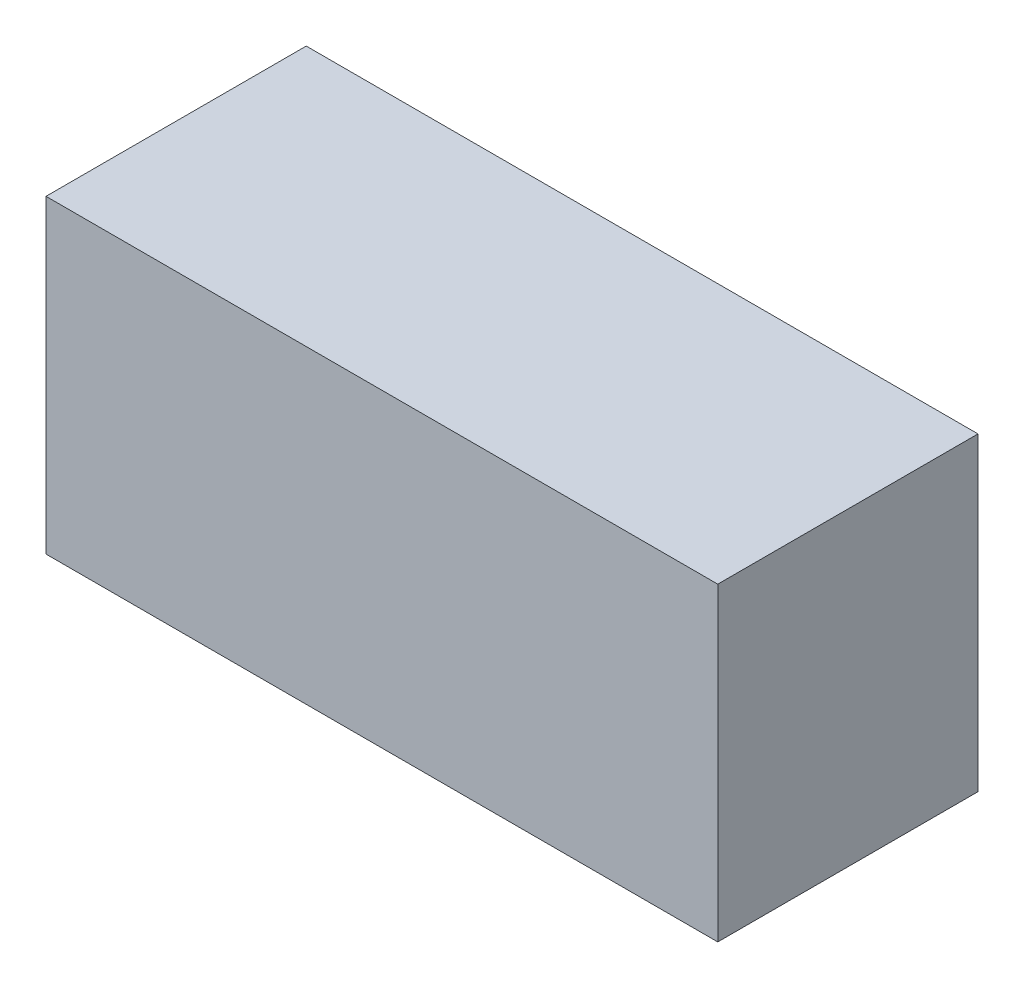
ISO-10303-21;
HEADER;
FILE_DESCRIPTION(('STEP AP214'),'2;1');
FILE_NAME('part.step','',(''),(''),'','','');
FILE_SCHEMA(('AUTOMOTIVE_DESIGN { 1 0 10303 214 1 1 1 1 }'));
ENDSEC;
DATA;
#1=APPLICATION_CONTEXT('core data for automotive mechanical design processes');
#2=APPLICATION_PROTOCOL_DEFINITION('international standard','automotive_design',2000,#1);
#3=PRODUCT_CONTEXT('',#1,'mechanical');
#4=PRODUCT('Part','Part','',(#3));
#5=PRODUCT_RELATED_PRODUCT_CATEGORY('part','',(#4));
#6=PRODUCT_DEFINITION_FORMATION('','',#4);
#7=PRODUCT_DEFINITION_CONTEXT('part definition',#1,'design');
#8=PRODUCT_DEFINITION('design','',#6,#7);
#9=PRODUCT_DEFINITION_SHAPE('','',#8);
#10=(LENGTH_UNIT() NAMED_UNIT(*) SI_UNIT(.MILLI.,.METRE.));
#11=(NAMED_UNIT(*) PLANE_ANGLE_UNIT() SI_UNIT($,.RADIAN.));
#12=(NAMED_UNIT(*) SI_UNIT($,.STERADIAN.) SOLID_ANGLE_UNIT());
#13=UNCERTAINTY_MEASURE_WITH_UNIT(LENGTH_MEASURE(1.E-05),#10,'distance_accuracy_value','');
#14=(GEOMETRIC_REPRESENTATION_CONTEXT(3) GLOBAL_UNCERTAINTY_ASSIGNED_CONTEXT((#13)) GLOBAL_UNIT_ASSIGNED_CONTEXT((#10,
#11,#12)) REPRESENTATION_CONTEXT('',''));
#15=CARTESIAN_POINT('',(0.,0.,0.));
#16=DIRECTION('',(0.,0.,1.));
#17=DIRECTION('',(1.,0.,0.));
#18=AXIS2_PLACEMENT_3D('',#15,#16,#17);
#19=CARTESIAN_POINT('',(0.,0.,21.5));
#20=DIRECTION('',(0.,0.,-1.));
#21=DIRECTION('',(-1.,0.,0.));
#22=AXIS2_PLACEMENT_3D('',#19,#20,#21);
#23=PLANE('',#22);
#24=DIRECTION('',(0.,-1.,0.));
#25=VECTOR('',#24,1.);
#26=CARTESIAN_POINT('',(-27.75,12.8,21.5));
#27=LINE('',#26,#25);
#28=CARTESIAN_POINT('',(-27.75,12.8,21.5));
#29=VERTEX_POINT('',#28);
#30=CARTESIAN_POINT('',(-27.75,-12.8,21.5));
#31=VERTEX_POINT('',#30);
#32=EDGE_CURVE('E140',#29,#31,#27,.T.);
#33=ORIENTED_EDGE('',*,*,#32,.T.);
#34=DIRECTION('',(1.,0.,0.));
#35=VECTOR('',#34,1.);
#36=CARTESIAN_POINT('',(27.75,-12.8,21.5));
#37=LINE('',#36,#35);
#38=CARTESIAN_POINT('',(27.75,-12.8,21.5));
#39=VERTEX_POINT('',#38);
#40=EDGE_CURVE('E143',#31,#39,#37,.T.);
#41=ORIENTED_EDGE('',*,*,#40,.T.);
#42=DIRECTION('',(0.,1.,0.));
#43=VECTOR('',#42,1.);
#44=CARTESIAN_POINT('',(27.75,12.8,21.5));
#45=LINE('',#44,#43);
#46=CARTESIAN_POINT('',(27.75,12.8,21.5));
#47=VERTEX_POINT('',#46);
#48=EDGE_CURVE('E146',#39,#47,#45,.T.);
#49=ORIENTED_EDGE('',*,*,#48,.T.);
#50=DIRECTION('',(-1.,0.,0.));
#51=VECTOR('',#50,1.);
#52=CARTESIAN_POINT('',(27.75,12.8,21.5));
#53=LINE('',#52,#51);
#54=EDGE_CURVE('E148',#47,#29,#53,.T.);
#55=ORIENTED_EDGE('',*,*,#54,.T.);
#56=EDGE_LOOP('',(#33,#41,#49,#55));
#57=FACE_BOUND('',#56,.T.);
#58=ADVANCED_FACE('F35',(#57),#23,.F.);
#59=CARTESIAN_POINT('',(0.,0.,0.));
#60=DIRECTION('',(0.,0.,-1.));
#61=DIRECTION('',(-1.,0.,0.));
#62=AXIS2_PLACEMENT_3D('',#59,#60,#61);
#63=PLANE('',#62);
#64=DIRECTION('',(-1.,0.,0.));
#65=VECTOR('',#64,1.);
#66=CARTESIAN_POINT('',(-19.75,10.,0.));
#67=LINE('',#66,#65);
#68=CARTESIAN_POINT('',(-19.75,10.,0.));
#69=VERTEX_POINT('',#68);
#70=CARTESIAN_POINT('',(-24.75,10.,0.));
#71=VERTEX_POINT('',#70);
#72=EDGE_CURVE('E106',#69,#71,#67,.T.);
#73=ORIENTED_EDGE('',*,*,#72,.T.);
#74=DIRECTION('',(0.,-1.,0.));
#75=VECTOR('',#74,1.);
#76=CARTESIAN_POINT('',(-24.75,10.,0.));
#77=LINE('',#76,#75);
#78=CARTESIAN_POINT('',(-24.75,-10.,0.));
#79=VERTEX_POINT('',#78);
#80=EDGE_CURVE('E126',#71,#79,#77,.T.);
#81=ORIENTED_EDGE('',*,*,#80,.T.);
#82=DIRECTION('',(1.,0.,0.));
#83=VECTOR('',#82,1.);
#84=CARTESIAN_POINT('',(-19.75,-10.,0.));
#85=LINE('',#84,#83);
#86=CARTESIAN_POINT('',(-19.75,-10.,0.));
#87=VERTEX_POINT('',#86);
#88=EDGE_CURVE('E129',#79,#87,#85,.T.);
#89=ORIENTED_EDGE('',*,*,#88,.T.);
#90=DIRECTION('',(0.,1.,0.));
#91=VECTOR('',#90,1.);
#92=CARTESIAN_POINT('',(-19.75,10.,0.));
#93=LINE('',#92,#91);
#94=EDGE_CURVE('E132',#87,#69,#93,.T.);
#95=ORIENTED_EDGE('',*,*,#94,.T.);
#96=EDGE_LOOP('',(#73,#81,#89,#95));
#97=FACE_BOUND('',#96,.T.);
#98=DIRECTION('',(0.,-1.,0.));
#99=VECTOR('',#98,1.);
#100=CARTESIAN_POINT('',(-27.75,12.8,0.));
#101=LINE('',#100,#99);
#102=CARTESIAN_POINT('',(-27.75,12.8,0.));
#103=VERTEX_POINT('',#102);
#104=CARTESIAN_POINT('',(-27.75,-12.8,0.));
#105=VERTEX_POINT('',#104);
#106=EDGE_CURVE('E139',#103,#105,#101,.T.);
#107=ORIENTED_EDGE('',*,*,#106,.F.);
#108=DIRECTION('',(-1.,0.,0.));
#109=VECTOR('',#108,1.);
#110=CARTESIAN_POINT('',(27.75,12.8,0.));
#111=LINE('',#110,#109);
#112=CARTESIAN_POINT('',(27.75,12.8,0.));
#113=VERTEX_POINT('',#112);
#114=EDGE_CURVE('E144',#113,#103,#111,.T.);
#115=ORIENTED_EDGE('',*,*,#114,.F.);
#116=DIRECTION('',(0.,1.,0.));
#117=VECTOR('',#116,1.);
#118=CARTESIAN_POINT('',(27.75,12.8,0.));
#119=LINE('',#118,#117);
#120=CARTESIAN_POINT('',(27.75,-12.8,0.));
#121=VERTEX_POINT('',#120);
#122=EDGE_CURVE('E155',#121,#113,#119,.T.);
#123=ORIENTED_EDGE('',*,*,#122,.F.);
#124=DIRECTION('',(1.,0.,0.));
#125=VECTOR('',#124,1.);
#126=CARTESIAN_POINT('',(27.75,-12.8,0.));
#127=LINE('',#126,#125);
#128=EDGE_CURVE('E153',#105,#121,#127,.T.);
#129=ORIENTED_EDGE('',*,*,#128,.F.);
#130=EDGE_LOOP('',(#107,#115,#123,#129));
#131=FACE_BOUND('',#130,.T.);
#132=CARTESIAN_POINT('',(15.75,0.,0.));
#133=DIRECTION('',(0.,0.,1.));
#134=DIRECTION('',(1.,0.,0.));
#135=AXIS2_PLACEMENT_3D('',#132,#133,#134);
#136=CIRCLE('',#135,10.);
#137=CARTESIAN_POINT('',(25.75,0.,0.));
#138=VERTEX_POINT('',#137);
#139=EDGE_CURVE('E122',#138,#138,#136,.T.);
#140=ORIENTED_EDGE('',*,*,#139,.T.);
#141=EDGE_LOOP('',(#140));
#142=FACE_BOUND('',#141,.T.);
#143=ADVANCED_FACE('F176',(#97,#131,#142),#63,.T.);
#144=CARTESIAN_POINT('',(-27.75,12.8,21.5));
#145=DIRECTION('',(1.,0.,0.));
#146=DIRECTION('',(0.,0.,-1.));
#147=AXIS2_PLACEMENT_3D('',#144,#145,#146);
#148=PLANE('',#147);
#149=ORIENTED_EDGE('',*,*,#106,.T.);
#150=DIRECTION('',(0.,0.,-1.));
#151=VECTOR('',#150,1.);
#152=CARTESIAN_POINT('',(-27.75,-12.8,21.5));
#153=LINE('',#152,#151);
#154=EDGE_CURVE('E43',#31,#105,#153,.T.);
#155=ORIENTED_EDGE('',*,*,#154,.F.);
#156=ORIENTED_EDGE('',*,*,#32,.F.);
#157=DIRECTION('',(0.,0.,-1.));
#158=VECTOR('',#157,1.);
#159=CARTESIAN_POINT('',(-27.75,12.8,21.5));
#160=LINE('',#159,#158);
#161=EDGE_CURVE('E150',#29,#103,#160,.T.);
#162=ORIENTED_EDGE('',*,*,#161,.T.);
#163=EDGE_LOOP('',(#149,#155,#156,#162));
#164=FACE_BOUND('',#163,.T.);
#165=ADVANCED_FACE('F37',(#164),#148,.F.);
#166=CARTESIAN_POINT('',(27.75,-12.8,21.5));
#167=DIRECTION('',(0.,1.,0.));
#168=DIRECTION('',(0.,0.,1.));
#169=AXIS2_PLACEMENT_3D('',#166,#167,#168);
#170=PLANE('',#169);
#171=ORIENTED_EDGE('',*,*,#128,.T.);
#172=DIRECTION('',(0.,0.,-1.));
#173=VECTOR('',#172,1.);
#174=CARTESIAN_POINT('',(27.75,-12.8,21.5));
#175=LINE('',#174,#173);
#176=EDGE_CURVE('E163',#39,#121,#175,.T.);
#177=ORIENTED_EDGE('',*,*,#176,.F.);
#178=ORIENTED_EDGE('',*,*,#40,.F.);
#179=ORIENTED_EDGE('',*,*,#154,.T.);
#180=EDGE_LOOP('',(#171,#177,#178,#179));
#181=FACE_BOUND('',#180,.T.);
#182=ADVANCED_FACE('F168',(#181),#170,.F.);
#183=CARTESIAN_POINT('',(27.75,12.8,21.5));
#184=DIRECTION('',(-1.,0.,0.));
#185=DIRECTION('',(0.,0.,1.));
#186=AXIS2_PLACEMENT_3D('',#183,#184,#185);
#187=PLANE('',#186);
#188=ORIENTED_EDGE('',*,*,#122,.T.);
#189=DIRECTION('',(0.,0.,-1.));
#190=VECTOR('',#189,1.);
#191=CARTESIAN_POINT('',(27.75,12.8,21.5));
#192=LINE('',#191,#190);
#193=EDGE_CURVE('E160',#47,#113,#192,.T.);
#194=ORIENTED_EDGE('',*,*,#193,.F.);
#195=ORIENTED_EDGE('',*,*,#48,.F.);
#196=ORIENTED_EDGE('',*,*,#176,.T.);
#197=EDGE_LOOP('',(#188,#194,#195,#196));
#198=FACE_BOUND('',#197,.T.);
#199=ADVANCED_FACE('F181',(#198),#187,.F.);
#200=CARTESIAN_POINT('',(27.75,12.8,21.5));
#201=DIRECTION('',(0.,-1.,0.));
#202=DIRECTION('',(0.,0.,-1.));
#203=AXIS2_PLACEMENT_3D('',#200,#201,#202);
#204=PLANE('',#203);
#205=ORIENTED_EDGE('',*,*,#114,.T.);
#206=ORIENTED_EDGE('',*,*,#161,.F.);
#207=ORIENTED_EDGE('',*,*,#54,.F.);
#208=ORIENTED_EDGE('',*,*,#193,.T.);
#209=EDGE_LOOP('',(#205,#206,#207,#208));
#210=FACE_BOUND('',#209,.T.);
#211=ADVANCED_FACE('F185',(#210),#204,.F.);
#212=CARTESIAN_POINT('',(-24.75,10.,21.5));
#213=DIRECTION('',(1.,0.,0.));
#214=DIRECTION('',(0.,0.,-1.));
#215=AXIS2_PLACEMENT_3D('',#212,#213,#214);
#216=PLANE('',#215);
#217=DIRECTION('',(0.,-1.,0.));
#218=VECTOR('',#217,1.);
#219=CARTESIAN_POINT('',(-24.75,0.,3.));
#220=LINE('',#219,#218);
#221=CARTESIAN_POINT('',(-24.75,10.,3.));
#222=VERTEX_POINT('',#221);
#223=CARTESIAN_POINT('',(-24.75,-10.,3.));
#224=VERTEX_POINT('',#223);
#225=EDGE_CURVE('E50',#222,#224,#220,.T.);
#226=ORIENTED_EDGE('',*,*,#225,.T.);
#227=DIRECTION('',(0.,0.,-1.));
#228=VECTOR('',#227,1.);
#229=CARTESIAN_POINT('',(-24.75,-10.,21.5));
#230=LINE('',#229,#228);
#231=EDGE_CURVE('E137',#224,#79,#230,.T.);
#232=ORIENTED_EDGE('',*,*,#231,.T.);
#233=ORIENTED_EDGE('',*,*,#80,.F.);
#234=DIRECTION('',(0.,0.,-1.));
#235=VECTOR('',#234,1.);
#236=CARTESIAN_POINT('',(-24.75,10.,21.5));
#237=LINE('',#236,#235);
#238=EDGE_CURVE('E111',#222,#71,#237,.T.);
#239=ORIENTED_EDGE('',*,*,#238,.F.);
#240=EDGE_LOOP('',(#226,#232,#233,#239));
#241=FACE_BOUND('',#240,.T.);
#242=ADVANCED_FACE('F195',(#241),#216,.T.);
#243=CARTESIAN_POINT('',(-19.75,-10.,21.5));
#244=DIRECTION('',(0.,1.,0.));
#245=DIRECTION('',(0.,0.,1.));
#246=AXIS2_PLACEMENT_3D('',#243,#244,#245);
#247=PLANE('',#246);
#248=DIRECTION('',(-1.,0.,0.));
#249=VECTOR('',#248,1.);
#250=CARTESIAN_POINT('',(0.,-10.,3.));
#251=LINE('',#250,#249);
#252=CARTESIAN_POINT('',(-19.75,-10.,3.));
#253=VERTEX_POINT('',#252);
#254=EDGE_CURVE('E57',#253,#224,#251,.T.);
#255=ORIENTED_EDGE('',*,*,#254,.F.);
#256=DIRECTION('',(0.,0.,-1.));
#257=VECTOR('',#256,1.);
#258=CARTESIAN_POINT('',(-19.75,-10.,21.5));
#259=LINE('',#258,#257);
#260=EDGE_CURVE('E110',#253,#87,#259,.T.);
#261=ORIENTED_EDGE('',*,*,#260,.T.);
#262=ORIENTED_EDGE('',*,*,#88,.F.);
#263=ORIENTED_EDGE('',*,*,#231,.F.);
#264=EDGE_LOOP('',(#255,#261,#262,#263));
#265=FACE_BOUND('',#264,.T.);
#266=ADVANCED_FACE('F241',(#265),#247,.T.);
#267=CARTESIAN_POINT('',(-19.75,10.,21.5));
#268=DIRECTION('',(-1.,0.,0.));
#269=DIRECTION('',(0.,-1.,0.));
#270=AXIS2_PLACEMENT_3D('',#267,#268,#269);
#271=PLANE('',#270);
#272=DIRECTION('',(0.,-1.,0.));
#273=VECTOR('',#272,1.);
#274=CARTESIAN_POINT('',(-19.75,0.,3.));
#275=LINE('',#274,#273);
#276=CARTESIAN_POINT('',(-19.75,10.,3.));
#277=VERTEX_POINT('',#276);
#278=EDGE_CURVE('E114',#277,#253,#275,.T.);
#279=ORIENTED_EDGE('',*,*,#278,.F.);
#280=DIRECTION('',(0.,0.,-1.));
#281=VECTOR('',#280,1.);
#282=CARTESIAN_POINT('',(-19.75,10.,21.5));
#283=LINE('',#282,#281);
#284=EDGE_CURVE('E100',#277,#69,#283,.T.);
#285=ORIENTED_EDGE('',*,*,#284,.T.);
#286=ORIENTED_EDGE('',*,*,#94,.F.);
#287=ORIENTED_EDGE('',*,*,#260,.F.);
#288=EDGE_LOOP('',(#279,#285,#286,#287));
#289=FACE_BOUND('',#288,.T.);
#290=ADVANCED_FACE('F115',(#289),#271,.T.);
#291=CARTESIAN_POINT('',(-19.75,10.,21.5));
#292=DIRECTION('',(0.,-1.,0.));
#293=DIRECTION('',(0.,0.,-1.));
#294=AXIS2_PLACEMENT_3D('',#291,#292,#293);
#295=PLANE('',#294);
#296=DIRECTION('',(-1.,0.,0.));
#297=VECTOR('',#296,1.);
#298=CARTESIAN_POINT('',(0.,10.,3.));
#299=LINE('',#298,#297);
#300=EDGE_CURVE('E104',#277,#222,#299,.T.);
#301=ORIENTED_EDGE('',*,*,#300,.T.);
#302=ORIENTED_EDGE('',*,*,#238,.T.);
#303=ORIENTED_EDGE('',*,*,#72,.F.);
#304=ORIENTED_EDGE('',*,*,#284,.F.);
#305=EDGE_LOOP('',(#301,#302,#303,#304));
#306=FACE_BOUND('',#305,.T.);
#307=ADVANCED_FACE('F102',(#306),#295,.T.);
#308=CARTESIAN_POINT('',(15.75,0.,21.5));
#309=DIRECTION('',(0.,0.,-1.));
#310=DIRECTION('',(-1.,0.,0.));
#311=AXIS2_PLACEMENT_3D('',#308,#309,#310);
#312=CYLINDRICAL_SURFACE('',#311,10.);
#313=CARTESIAN_POINT('',(15.75,0.,3.));
#314=DIRECTION('',(0.,0.,-1.));
#315=DIRECTION('',(-1.,0.,0.));
#316=AXIS2_PLACEMENT_3D('',#313,#314,#315);
#317=CIRCLE('',#316,10.);
#318=CARTESIAN_POINT('',(5.75000000000001,0.,3.));
#319=VERTEX_POINT('',#318);
#320=EDGE_CURVE('E12',#319,#319,#317,.T.);
#321=ORIENTED_EDGE('',*,*,#320,.F.);
#322=EDGE_LOOP('',(#321));
#323=FACE_BOUND('',#322,.T.);
#324=ORIENTED_EDGE('',*,*,#139,.F.);
#325=EDGE_LOOP('',(#324));
#326=FACE_BOUND('',#325,.T.);
#327=ADVANCED_FACE('F261',(#323,#326),#312,.F.);
#328=CARTESIAN_POINT('',(0.,0.,3.));
#329=DIRECTION('',(0.,0.,-1.));
#330=DIRECTION('',(-1.,0.,0.));
#331=AXIS2_PLACEMENT_3D('',#328,#329,#330);
#332=PLANE('',#331);
#333=ORIENTED_EDGE('',*,*,#278,.T.);
#334=ORIENTED_EDGE('',*,*,#254,.T.);
#335=ORIENTED_EDGE('',*,*,#225,.F.);
#336=ORIENTED_EDGE('',*,*,#300,.F.);
#337=EDGE_LOOP('',(#333,#334,#335,#336));
#338=FACE_BOUND('',#337,.T.);
#339=ADVANCED_FACE('F118',(#338),#332,.T.);
#340=CARTESIAN_POINT('',(0.,0.,3.));
#341=DIRECTION('',(0.,0.,-1.));
#342=DIRECTION('',(-1.,0.,0.));
#343=AXIS2_PLACEMENT_3D('',#340,#341,#342);
#344=PLANE('',#343);
#345=ORIENTED_EDGE('',*,*,#320,.T.);
#346=EDGE_LOOP('',(#345));
#347=FACE_BOUND('',#346,.T.);
#348=ADVANCED_FACE('F283',(#347),#344,.T.);
#349=CLOSED_SHELL('',(#58,#143,#165,#182,#199,#211,#242,#266,#290,#307,#327,#339,#348));
#350=MANIFOLD_SOLID_BREP('B2',#349);
#351=ADVANCED_BREP_SHAPE_REPRESENTATION('',(#18,#350),#14);
#352=SHAPE_DEFINITION_REPRESENTATION(#9,#351);
ENDSEC;
END-ISO-10303-21;
